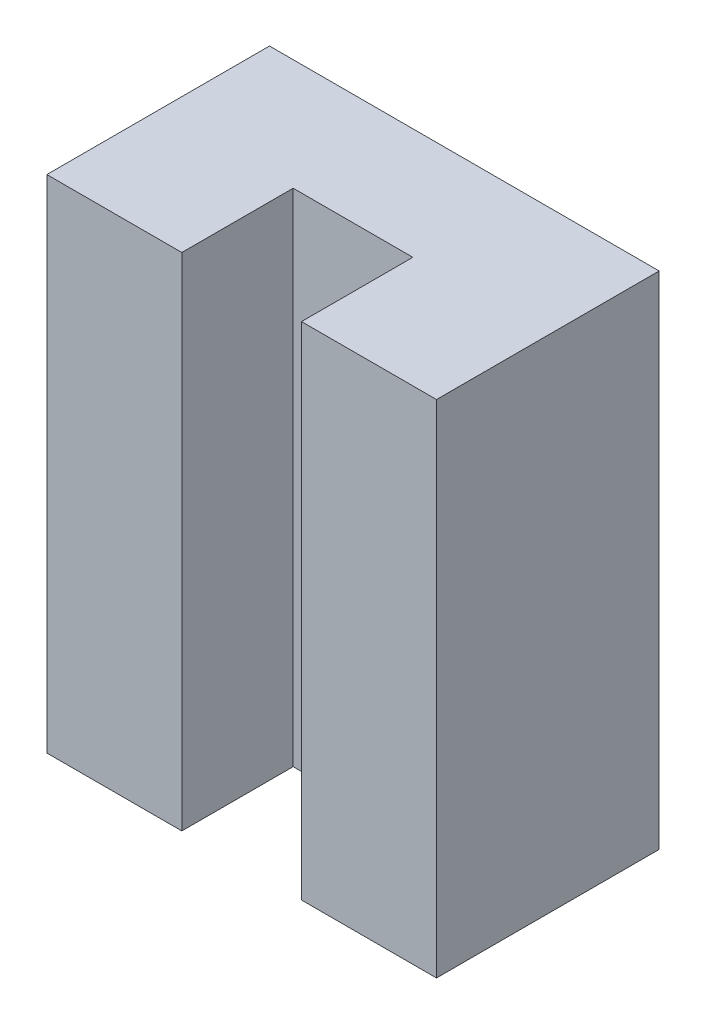
ISO-10303-21;
HEADER;
FILE_DESCRIPTION(('STEP AP214'),'2;1');
FILE_NAME('part.step','',(''),(''),'','','');
FILE_SCHEMA(('AUTOMOTIVE_DESIGN { 1 0 10303 214 1 1 1 1 }'));
ENDSEC;
DATA;
#1=APPLICATION_CONTEXT('core data for automotive mechanical design processes');
#2=APPLICATION_PROTOCOL_DEFINITION('international standard','automotive_design',2000,#1);
#3=PRODUCT_CONTEXT('',#1,'mechanical');
#4=PRODUCT('Part','Part','',(#3));
#5=PRODUCT_RELATED_PRODUCT_CATEGORY('part','',(#4));
#6=PRODUCT_DEFINITION_FORMATION('','',#4);
#7=PRODUCT_DEFINITION_CONTEXT('part definition',#1,'design');
#8=PRODUCT_DEFINITION('design','',#6,#7);
#9=PRODUCT_DEFINITION_SHAPE('','',#8);
#10=(LENGTH_UNIT() NAMED_UNIT(*) SI_UNIT(.MILLI.,.METRE.));
#11=(NAMED_UNIT(*) PLANE_ANGLE_UNIT() SI_UNIT($,.RADIAN.));
#12=(NAMED_UNIT(*) SI_UNIT($,.STERADIAN.) SOLID_ANGLE_UNIT());
#13=UNCERTAINTY_MEASURE_WITH_UNIT(LENGTH_MEASURE(1.E-05),#10,'distance_accuracy_value','');
#14=(GEOMETRIC_REPRESENTATION_CONTEXT(3) GLOBAL_UNCERTAINTY_ASSIGNED_CONTEXT((#13)) GLOBAL_UNIT_ASSIGNED_CONTEXT((#10,
#11,#12)) REPRESENTATION_CONTEXT('',''));
#15=CARTESIAN_POINT('',(0.,0.,0.));
#16=DIRECTION('',(0.,0.,1.));
#17=DIRECTION('',(1.,0.,0.));
#18=AXIS2_PLACEMENT_3D('',#15,#16,#17);
#19=CARTESIAN_POINT('',(-152.,-92.,-161.));
#20=DIRECTION('',(0.,0.,1.));
#21=DIRECTION('',(1.,0.,0.));
#22=AXIS2_PLACEMENT_3D('',#19,#20,#21);
#23=PLANE('',#22);
#24=DIRECTION('',(1.,0.,0.));
#25=VECTOR('',#24,1.);
#26=CARTESIAN_POINT('',(-152.,-92.,-161.));
#27=LINE('',#26,#25);
#28=CARTESIAN_POINT('',(-152.,-92.,-161.));
#29=VERTEX_POINT('',#28);
#30=CARTESIAN_POINT('',(-147.15,-92.,-161.));
#31=VERTEX_POINT('',#30);
#32=EDGE_CURVE('E87',#29,#31,#27,.T.);
#33=ORIENTED_EDGE('',*,*,#32,.T.);
#34=DIRECTION('',(0.,1.,0.));
#35=VECTOR('',#34,1.);
#36=CARTESIAN_POINT('',(-147.15,-93.,-161.));
#37=LINE('',#36,#35);
#38=CARTESIAN_POINT('',(-147.15,-74.,-161.));
#39=VERTEX_POINT('',#38);
#40=EDGE_CURVE('E20',#39,#31,#37,.F.);
#41=ORIENTED_EDGE('',*,*,#40,.F.);
#42=DIRECTION('',(1.,0.,0.));
#43=VECTOR('',#42,1.);
#44=CARTESIAN_POINT('',(-152.,-74.,-161.));
#45=LINE('',#44,#43);
#46=CARTESIAN_POINT('',(-152.,-74.,-161.));
#47=VERTEX_POINT('',#46);
#48=EDGE_CURVE('E88',#47,#39,#45,.T.);
#49=ORIENTED_EDGE('',*,*,#48,.F.);
#50=DIRECTION('',(0.,1.,0.));
#51=VECTOR('',#50,1.);
#52=CARTESIAN_POINT('',(-152.,-92.,-161.));
#53=LINE('',#52,#51);
#54=EDGE_CURVE('E85',#47,#29,#53,.F.);
#55=ORIENTED_EDGE('',*,*,#54,.T.);
#56=EDGE_LOOP('',(#33,#41,#49,#55));
#57=FACE_BOUND('',#56,.T.);
#58=ADVANCED_FACE('F17',(#57),#23,.T.);
#59=CARTESIAN_POINT('',(-147.15,-93.,-165.));
#60=DIRECTION('',(1.,0.,0.));
#61=DIRECTION('',(0.,0.,-1.));
#62=AXIS2_PLACEMENT_3D('',#59,#60,#61);
#63=PLANE('',#62);
#64=DIRECTION('',(0.,0.,1.));
#65=VECTOR('',#64,1.);
#66=CARTESIAN_POINT('',(-147.15,-74.,-169.));
#67=LINE('',#66,#65);
#68=CARTESIAN_POINT('',(-147.15,-74.,-165.));
#69=VERTEX_POINT('',#68);
#70=EDGE_CURVE('E139',#39,#69,#67,.F.);
#71=ORIENTED_EDGE('',*,*,#70,.F.);
#72=ORIENTED_EDGE('',*,*,#40,.T.);
#73=DIRECTION('',(0.,0.,1.));
#74=VECTOR('',#73,1.);
#75=CARTESIAN_POINT('',(-147.15,-92.,-169.));
#76=LINE('',#75,#74);
#77=CARTESIAN_POINT('',(-147.15,-92.,-165.));
#78=VERTEX_POINT('',#77);
#79=EDGE_CURVE('E102',#31,#78,#76,.F.);
#80=ORIENTED_EDGE('',*,*,#79,.T.);
#81=DIRECTION('',(0.,1.,0.));
#82=VECTOR('',#81,1.);
#83=CARTESIAN_POINT('',(-147.15,-93.,-165.));
#84=LINE('',#83,#82);
#85=EDGE_CURVE('E113',#69,#78,#84,.F.);
#86=ORIENTED_EDGE('',*,*,#85,.F.);
#87=EDGE_LOOP('',(#71,#72,#80,#86));
#88=FACE_BOUND('',#87,.T.);
#89=ADVANCED_FACE('F125',(#88),#63,.T.);
#90=CARTESIAN_POINT('',(-147.15,-93.,-165.));
#91=DIRECTION('',(0.,0.,1.));
#92=DIRECTION('',(1.,0.,0.));
#93=AXIS2_PLACEMENT_3D('',#90,#91,#92);
#94=PLANE('',#93);
#95=DIRECTION('',(0.,1.,0.));
#96=VECTOR('',#95,1.);
#97=CARTESIAN_POINT('',(-142.85,-93.,-165.));
#98=LINE('',#97,#96);
#99=CARTESIAN_POINT('',(-142.85,-92.,-165.));
#100=VERTEX_POINT('',#99);
#101=CARTESIAN_POINT('',(-142.85,-74.,-165.));
#102=VERTEX_POINT('',#101);
#103=EDGE_CURVE('E111',#100,#102,#98,.T.);
#104=ORIENTED_EDGE('',*,*,#103,.T.);
#105=DIRECTION('',(1.,0.,0.));
#106=VECTOR('',#105,1.);
#107=CARTESIAN_POINT('',(-152.,-74.,-165.));
#108=LINE('',#107,#106);
#109=EDGE_CURVE('E120',#69,#102,#108,.T.);
#110=ORIENTED_EDGE('',*,*,#109,.F.);
#111=ORIENTED_EDGE('',*,*,#85,.T.);
#112=DIRECTION('',(1.,0.,0.));
#113=VECTOR('',#112,1.);
#114=CARTESIAN_POINT('',(-152.,-92.,-165.));
#115=LINE('',#114,#113);
#116=EDGE_CURVE('E119',#78,#100,#115,.T.);
#117=ORIENTED_EDGE('',*,*,#116,.T.);
#118=EDGE_LOOP('',(#104,#110,#111,#117));
#119=FACE_BOUND('',#118,.T.);
#120=ADVANCED_FACE('F118',(#119),#94,.T.);
#121=CARTESIAN_POINT('',(-142.85,-93.,-165.));
#122=DIRECTION('',(1.,0.,0.));
#123=DIRECTION('',(0.,0.,-1.));
#124=AXIS2_PLACEMENT_3D('',#121,#122,#123);
#125=PLANE('',#124);
#126=DIRECTION('',(0.,0.,1.));
#127=VECTOR('',#126,1.);
#128=CARTESIAN_POINT('',(-142.85,-74.,-169.));
#129=LINE('',#128,#127);
#130=CARTESIAN_POINT('',(-142.85,-74.,-161.));
#131=VERTEX_POINT('',#130);
#132=EDGE_CURVE('E142',#102,#131,#129,.T.);
#133=ORIENTED_EDGE('',*,*,#132,.F.);
#134=ORIENTED_EDGE('',*,*,#103,.F.);
#135=DIRECTION('',(0.,0.,1.));
#136=VECTOR('',#135,1.);
#137=CARTESIAN_POINT('',(-142.85,-92.,-169.));
#138=LINE('',#137,#136);
#139=CARTESIAN_POINT('',(-142.85,-92.,-161.));
#140=VERTEX_POINT('',#139);
#141=EDGE_CURVE('E123',#100,#140,#138,.T.);
#142=ORIENTED_EDGE('',*,*,#141,.T.);
#143=DIRECTION('',(0.,1.,0.));
#144=VECTOR('',#143,1.);
#145=CARTESIAN_POINT('',(-142.85,-92.,-161.));
#146=LINE('',#145,#144);
#147=EDGE_CURVE('E94',#131,#140,#146,.F.);
#148=ORIENTED_EDGE('',*,*,#147,.F.);
#149=EDGE_LOOP('',(#133,#134,#142,#148));
#150=FACE_BOUND('',#149,.T.);
#151=ADVANCED_FACE('F160',(#150),#125,.F.);
#152=CARTESIAN_POINT('',(-152.,-92.,-161.));
#153=DIRECTION('',(0.,0.,1.));
#154=DIRECTION('',(1.,0.,0.));
#155=AXIS2_PLACEMENT_3D('',#152,#153,#154);
#156=PLANE('',#155);
#157=DIRECTION('',(1.,0.,0.));
#158=VECTOR('',#157,1.);
#159=CARTESIAN_POINT('',(-152.,-92.,-161.));
#160=LINE('',#159,#158);
#161=CARTESIAN_POINT('',(-138.,-92.,-161.));
#162=VERTEX_POINT('',#161);
#163=EDGE_CURVE('E128',#140,#162,#160,.T.);
#164=ORIENTED_EDGE('',*,*,#163,.T.);
#165=DIRECTION('',(0.,1.,0.));
#166=VECTOR('',#165,1.);
#167=CARTESIAN_POINT('',(-138.,-92.,-161.));
#168=LINE('',#167,#166);
#169=CARTESIAN_POINT('',(-138.,-74.,-161.));
#170=VERTEX_POINT('',#169);
#171=EDGE_CURVE('E132',#170,#162,#168,.F.);
#172=ORIENTED_EDGE('',*,*,#171,.F.);
#173=DIRECTION('',(1.,0.,0.));
#174=VECTOR('',#173,1.);
#175=CARTESIAN_POINT('',(-152.,-74.,-161.));
#176=LINE('',#175,#174);
#177=EDGE_CURVE('E144',#131,#170,#176,.T.);
#178=ORIENTED_EDGE('',*,*,#177,.F.);
#179=ORIENTED_EDGE('',*,*,#147,.T.);
#180=EDGE_LOOP('',(#164,#172,#178,#179));
#181=FACE_BOUND('',#180,.T.);
#182=ADVANCED_FACE('F163',(#181),#156,.T.);
#183=CARTESIAN_POINT('',(-152.,-92.,-169.));
#184=DIRECTION('',(1.,0.,0.));
#185=DIRECTION('',(0.,0.,-1.));
#186=AXIS2_PLACEMENT_3D('',#183,#184,#185);
#187=PLANE('',#186);
#188=DIRECTION('',(0.,0.,1.));
#189=VECTOR('',#188,1.);
#190=CARTESIAN_POINT('',(-152.,-74.,-169.));
#191=LINE('',#190,#189);
#192=CARTESIAN_POINT('',(-152.,-74.,-169.));
#193=VERTEX_POINT('',#192);
#194=EDGE_CURVE('E136',#193,#47,#191,.T.);
#195=ORIENTED_EDGE('',*,*,#194,.F.);
#196=DIRECTION('',(0.,1.,0.));
#197=VECTOR('',#196,1.);
#198=CARTESIAN_POINT('',(-152.,-92.,-169.));
#199=LINE('',#198,#197);
#200=CARTESIAN_POINT('',(-152.,-92.,-169.));
#201=VERTEX_POINT('',#200);
#202=EDGE_CURVE('E106',#193,#201,#199,.F.);
#203=ORIENTED_EDGE('',*,*,#202,.T.);
#204=DIRECTION('',(0.,0.,1.));
#205=VECTOR('',#204,1.);
#206=CARTESIAN_POINT('',(-152.,-92.,-169.));
#207=LINE('',#206,#205);
#208=EDGE_CURVE('E93',#201,#29,#207,.T.);
#209=ORIENTED_EDGE('',*,*,#208,.T.);
#210=ORIENTED_EDGE('',*,*,#54,.F.);
#211=EDGE_LOOP('',(#195,#203,#209,#210));
#212=FACE_BOUND('',#211,.T.);
#213=ADVANCED_FACE('F105',(#212),#187,.F.);
#214=CARTESIAN_POINT('',(-152.,-92.,-169.));
#215=DIRECTION('',(0.,1.,0.));
#216=DIRECTION('',(0.,0.,1.));
#217=AXIS2_PLACEMENT_3D('',#214,#215,#216);
#218=PLANE('',#217);
#219=ORIENTED_EDGE('',*,*,#141,.F.);
#220=ORIENTED_EDGE('',*,*,#116,.F.);
#221=ORIENTED_EDGE('',*,*,#79,.F.);
#222=ORIENTED_EDGE('',*,*,#32,.F.);
#223=ORIENTED_EDGE('',*,*,#208,.F.);
#224=DIRECTION('',(1.,0.,0.));
#225=VECTOR('',#224,1.);
#226=CARTESIAN_POINT('',(-152.,-92.,-169.));
#227=LINE('',#226,#225);
#228=CARTESIAN_POINT('',(-138.,-92.,-169.));
#229=VERTEX_POINT('',#228);
#230=EDGE_CURVE('E147',#201,#229,#227,.T.);
#231=ORIENTED_EDGE('',*,*,#230,.T.);
#232=DIRECTION('',(0.,0.,-1.));
#233=VECTOR('',#232,1.);
#234=CARTESIAN_POINT('',(-138.,-92.,-169.));
#235=LINE('',#234,#233);
#236=EDGE_CURVE('E130',#162,#229,#235,.T.);
#237=ORIENTED_EDGE('',*,*,#236,.F.);
#238=ORIENTED_EDGE('',*,*,#163,.F.);
#239=EDGE_LOOP('',(#219,#220,#221,#222,#223,#231,#237,#238));
#240=FACE_BOUND('',#239,.T.);
#241=ADVANCED_FACE('F98',(#240),#218,.F.);
#242=CARTESIAN_POINT('',(-138.,-92.,-169.));
#243=DIRECTION('',(1.,0.,0.));
#244=DIRECTION('',(0.,0.,-1.));
#245=AXIS2_PLACEMENT_3D('',#242,#243,#244);
#246=PLANE('',#245);
#247=DIRECTION('',(0.,0.,1.));
#248=VECTOR('',#247,1.);
#249=CARTESIAN_POINT('',(-138.,-74.,-169.));
#250=LINE('',#249,#248);
#251=CARTESIAN_POINT('',(-138.,-74.,-169.));
#252=VERTEX_POINT('',#251);
#253=EDGE_CURVE('E34',#170,#252,#250,.F.);
#254=ORIENTED_EDGE('',*,*,#253,.F.);
#255=ORIENTED_EDGE('',*,*,#171,.T.);
#256=ORIENTED_EDGE('',*,*,#236,.T.);
#257=DIRECTION('',(0.,1.,0.));
#258=VECTOR('',#257,1.);
#259=CARTESIAN_POINT('',(-138.,-92.,-169.));
#260=LINE('',#259,#258);
#261=EDGE_CURVE('E26',#229,#252,#260,.T.);
#262=ORIENTED_EDGE('',*,*,#261,.T.);
#263=EDGE_LOOP('',(#254,#255,#256,#262));
#264=FACE_BOUND('',#263,.T.);
#265=ADVANCED_FACE('F152',(#264),#246,.T.);
#266=CARTESIAN_POINT('',(-152.,-74.,-169.));
#267=DIRECTION('',(0.,1.,0.));
#268=DIRECTION('',(0.,0.,1.));
#269=AXIS2_PLACEMENT_3D('',#266,#267,#268);
#270=PLANE('',#269);
#271=ORIENTED_EDGE('',*,*,#132,.T.);
#272=ORIENTED_EDGE('',*,*,#177,.T.);
#273=ORIENTED_EDGE('',*,*,#253,.T.);
#274=DIRECTION('',(1.,0.,0.));
#275=VECTOR('',#274,1.);
#276=CARTESIAN_POINT('',(-152.,-74.,-169.));
#277=LINE('',#276,#275);
#278=EDGE_CURVE('E11',#252,#193,#277,.F.);
#279=ORIENTED_EDGE('',*,*,#278,.T.);
#280=ORIENTED_EDGE('',*,*,#194,.T.);
#281=ORIENTED_EDGE('',*,*,#48,.T.);
#282=ORIENTED_EDGE('',*,*,#70,.T.);
#283=ORIENTED_EDGE('',*,*,#109,.T.);
#284=EDGE_LOOP('',(#271,#272,#273,#279,#280,#281,#282,#283));
#285=FACE_BOUND('',#284,.T.);
#286=ADVANCED_FACE('F162',(#285),#270,.T.);
#287=CARTESIAN_POINT('',(-152.,-92.,-169.));
#288=DIRECTION('',(0.,0.,1.));
#289=DIRECTION('',(1.,0.,0.));
#290=AXIS2_PLACEMENT_3D('',#287,#288,#289);
#291=PLANE('',#290);
#292=ORIENTED_EDGE('',*,*,#261,.F.);
#293=ORIENTED_EDGE('',*,*,#230,.F.);
#294=ORIENTED_EDGE('',*,*,#202,.F.);
#295=ORIENTED_EDGE('',*,*,#278,.F.);
#296=EDGE_LOOP('',(#292,#293,#294,#295));
#297=FACE_BOUND('',#296,.T.);
#298=ADVANCED_FACE('F155',(#297),#291,.F.);
#299=CLOSED_SHELL('',(#58,#89,#120,#151,#182,#213,#241,#265,#286,#298));
#300=MANIFOLD_SOLID_BREP('B1',#299);
#301=ADVANCED_BREP_SHAPE_REPRESENTATION('',(#18,#300),#14);
#302=SHAPE_DEFINITION_REPRESENTATION(#9,#301);
ENDSEC;
END-ISO-10303-21;
